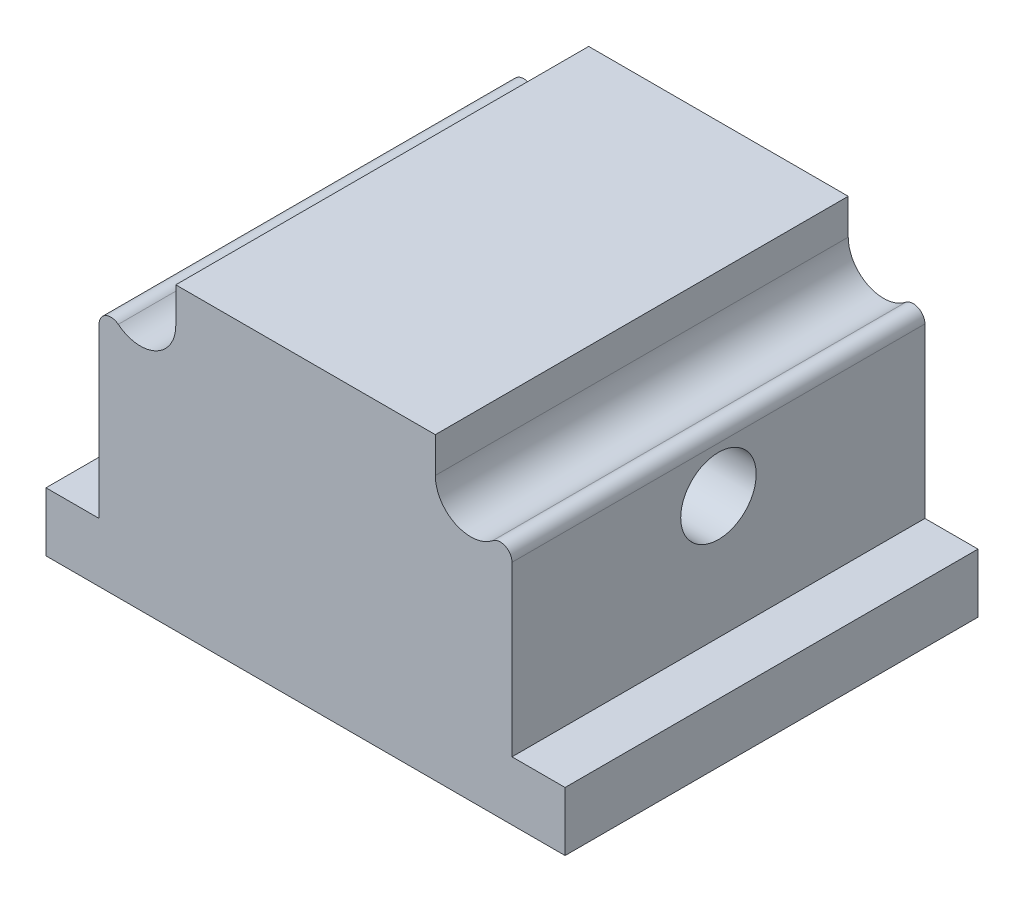
ISO-10303-21;
HEADER;
FILE_DESCRIPTION(('STEP AP214'),'2;1');
FILE_NAME('part.step','',(''),(''),'','','');
FILE_SCHEMA(('AUTOMOTIVE_DESIGN { 1 0 10303 214 1 1 1 1 }'));
ENDSEC;
DATA;
#1=APPLICATION_CONTEXT('core data for automotive mechanical design processes');
#2=APPLICATION_PROTOCOL_DEFINITION('international standard','automotive_design',2000,#1);
#3=PRODUCT_CONTEXT('',#1,'mechanical');
#4=PRODUCT('Part','Part','',(#3));
#5=PRODUCT_RELATED_PRODUCT_CATEGORY('part','',(#4));
#6=PRODUCT_DEFINITION_FORMATION('','',#4);
#7=PRODUCT_DEFINITION_CONTEXT('part definition',#1,'design');
#8=PRODUCT_DEFINITION('design','',#6,#7);
#9=PRODUCT_DEFINITION_SHAPE('','',#8);
#10=(LENGTH_UNIT() NAMED_UNIT(*) SI_UNIT(.MILLI.,.METRE.));
#11=(NAMED_UNIT(*) PLANE_ANGLE_UNIT() SI_UNIT($,.RADIAN.));
#12=(NAMED_UNIT(*) SI_UNIT($,.STERADIAN.) SOLID_ANGLE_UNIT());
#13=UNCERTAINTY_MEASURE_WITH_UNIT(LENGTH_MEASURE(1.E-05),#10,'distance_accuracy_value','');
#14=(GEOMETRIC_REPRESENTATION_CONTEXT(3) GLOBAL_UNCERTAINTY_ASSIGNED_CONTEXT((#13)) GLOBAL_UNIT_ASSIGNED_CONTEXT((#10,
#11,#12)) REPRESENTATION_CONTEXT('',''));
#15=CARTESIAN_POINT('',(0.,0.,0.));
#16=DIRECTION('',(0.,0.,1.));
#17=DIRECTION('',(1.,0.,0.));
#18=AXIS2_PLACEMENT_3D('',#15,#16,#17);
#19=CARTESIAN_POINT('',(0.,-7.7,0.));
#20=DIRECTION('',(0.,-1.,0.));
#21=DIRECTION('',(0.,0.,1.));
#22=AXIS2_PLACEMENT_3D('',#19,#20,#21);
#23=PLANE('',#22);
#24=DIRECTION('',(0.,0.,-1.));
#25=VECTOR('',#24,1.);
#26=CARTESIAN_POINT('',(11.,-7.7,-8.75));
#27=LINE('',#26,#25);
#28=CARTESIAN_POINT('',(11.,-7.7,8.75));
#29=VERTEX_POINT('',#28);
#30=CARTESIAN_POINT('',(11.,-7.7,-8.75));
#31=VERTEX_POINT('',#30);
#32=EDGE_CURVE('E284',#29,#31,#27,.T.);
#33=ORIENTED_EDGE('',*,*,#32,.F.);
#34=DIRECTION('',(1.,0.,0.));
#35=VECTOR('',#34,1.);
#36=CARTESIAN_POINT('',(-11.,-7.7,8.75));
#37=LINE('',#36,#35);
#38=CARTESIAN_POINT('',(-11.,-7.7,8.75));
#39=VERTEX_POINT('',#38);
#40=EDGE_CURVE('E294',#39,#29,#37,.T.);
#41=ORIENTED_EDGE('',*,*,#40,.F.);
#42=DIRECTION('',(0.,0.,1.));
#43=VECTOR('',#42,1.);
#44=CARTESIAN_POINT('',(-11.,-7.7,-8.75));
#45=LINE('',#44,#43);
#46=CARTESIAN_POINT('',(-11.,-7.7,-8.75));
#47=VERTEX_POINT('',#46);
#48=EDGE_CURVE('E291',#47,#39,#45,.T.);
#49=ORIENTED_EDGE('',*,*,#48,.F.);
#50=DIRECTION('',(-1.,0.,0.));
#51=VECTOR('',#50,1.);
#52=CARTESIAN_POINT('',(-11.,-7.7,-8.75));
#53=LINE('',#52,#51);
#54=EDGE_CURVE('E287',#31,#47,#53,.T.);
#55=ORIENTED_EDGE('',*,*,#54,.F.);
#56=EDGE_LOOP('',(#33,#41,#49,#55));
#57=FACE_BOUND('',#56,.T.);
#58=DIRECTION('',(0.951056516295154,0.,0.309016994374947));
#59=VECTOR('',#58,1.);
#60=CARTESIAN_POINT('',(-0.763932022500211,-7.7,2.35114100916989));
#61=LINE('',#60,#59);
#62=CARTESIAN_POINT('',(-8.,-7.7,0.));
#63=VERTEX_POINT('',#62);
#64=CARTESIAN_POINT('',(-2.47213595499958,-7.7,1.79611190631834));
#65=VERTEX_POINT('',#64);
#66=EDGE_CURVE('E214',#63,#65,#61,.T.);
#67=ORIENTED_EDGE('',*,*,#66,.T.);
#68=DIRECTION('',(0.,0.,1.));
#69=VECTOR('',#68,1.);
#70=CARTESIAN_POINT('',(-2.47213595499958,-7.7,0.));
#71=LINE('',#70,#69);
#72=CARTESIAN_POINT('',(-2.47213595499958,-7.7,7.60845213036123));
#73=VERTEX_POINT('',#72);
#74=EDGE_CURVE('E247',#65,#73,#71,.T.);
#75=ORIENTED_EDGE('',*,*,#74,.T.);
#76=DIRECTION('',(-0.587785252292473,0.,0.809016994374948));
#77=VECTOR('',#76,1.);
#78=CARTESIAN_POINT('',(2.,-7.7,1.45308505601072));
#79=LINE('',#78,#77);
#80=CARTESIAN_POINT('',(0.944271909999159,-7.7,2.90617011202144));
#81=VERTEX_POINT('',#80);
#82=EDGE_CURVE('E250',#81,#73,#79,.T.);
#83=ORIENTED_EDGE('',*,*,#82,.F.);
#84=DIRECTION('',(0.951056516295154,0.,0.309016994374947));
#85=VECTOR('',#84,1.);
#86=CARTESIAN_POINT('',(-0.763932022500211,-7.7,2.35114100916989));
#87=LINE('',#86,#85);
#88=CARTESIAN_POINT('',(6.47213595499958,-7.7,4.70228201833979));
#89=VERTEX_POINT('',#88);
#90=EDGE_CURVE('E253',#81,#89,#87,.T.);
#91=ORIENTED_EDGE('',*,*,#90,.T.);
#92=DIRECTION('',(0.587785252292473,0.,0.809016994374947));
#93=VECTOR('',#92,1.);
#94=CARTESIAN_POINT('',(2.,-7.7,-1.45308505601072));
#95=LINE('',#94,#93);
#96=CARTESIAN_POINT('',(3.05572809000084,-7.7,0.));
#97=VERTEX_POINT('',#96);
#98=EDGE_CURVE('E256',#97,#89,#95,.T.);
#99=ORIENTED_EDGE('',*,*,#98,.F.);
#100=DIRECTION('',(-0.587785252292473,0.,0.809016994374948));
#101=VECTOR('',#100,1.);
#102=CARTESIAN_POINT('',(2.,-7.7,1.45308505601072));
#103=LINE('',#102,#101);
#104=CARTESIAN_POINT('',(6.47213595499958,-7.7,-4.70228201833979));
#105=VERTEX_POINT('',#104);
#106=EDGE_CURVE('E259',#105,#97,#103,.T.);
#107=ORIENTED_EDGE('',*,*,#106,.F.);
#108=DIRECTION('',(0.951056516295154,0.,-0.309016994374948));
#109=VECTOR('',#108,1.);
#110=CARTESIAN_POINT('',(-0.763932022500211,-7.7,-2.35114100916989));
#111=LINE('',#110,#109);
#112=CARTESIAN_POINT('',(0.94427190999916,-7.7,-2.90617011202144));
#113=VERTEX_POINT('',#112);
#114=EDGE_CURVE('E262',#113,#105,#111,.T.);
#115=ORIENTED_EDGE('',*,*,#114,.F.);
#116=DIRECTION('',(0.587785252292473,0.,0.809016994374947));
#117=VECTOR('',#116,1.);
#118=CARTESIAN_POINT('',(2.,-7.7,-1.45308505601072));
#119=LINE('',#118,#117);
#120=CARTESIAN_POINT('',(-2.47213595499958,-7.7,-7.60845213036123));
#121=VERTEX_POINT('',#120);
#122=EDGE_CURVE('E223',#121,#113,#119,.T.);
#123=ORIENTED_EDGE('',*,*,#122,.F.);
#124=DIRECTION('',(0.,0.,1.));
#125=VECTOR('',#124,1.);
#126=CARTESIAN_POINT('',(-2.47213595499958,-7.7,0.));
#127=LINE('',#126,#125);
#128=CARTESIAN_POINT('',(-2.47213595499958,-7.7,-1.79611190631834));
#129=VERTEX_POINT('',#128);
#130=EDGE_CURVE('E220',#121,#129,#127,.T.);
#131=ORIENTED_EDGE('',*,*,#130,.T.);
#132=DIRECTION('',(0.951056516295154,0.,-0.309016994374948));
#133=VECTOR('',#132,1.);
#134=CARTESIAN_POINT('',(-0.763932022500211,-7.7,-2.35114100916989));
#135=LINE('',#134,#133);
#136=EDGE_CURVE('E244',#63,#129,#135,.T.);
#137=ORIENTED_EDGE('',*,*,#136,.F.);
#138=EDGE_LOOP('',(#67,#75,#83,#91,#99,#107,#115,#123,#131,#137));
#139=FACE_BOUND('',#138,.T.);
#140=ADVANCED_FACE('F37',(#57,#139),#23,.T.);
#141=CARTESIAN_POINT('',(-8.75,5.,-8.75000000000001));
#142=DIRECTION('',(1.,0.,0.));
#143=DIRECTION('',(0.,0.,1.));
#144=AXIS2_PLACEMENT_3D('',#141,#142,#143);
#145=PLANE('',#144);
#146=CARTESIAN_POINT('',(-8.75000000000001,0.,0.));
#147=DIRECTION('',(-1.,0.,0.));
#148=DIRECTION('',(0.,0.,1.));
#149=AXIS2_PLACEMENT_3D('',#146,#147,#148);
#150=CIRCLE('',#149,1.6);
#151=CARTESIAN_POINT('',(-8.75000000000001,0.,1.6));
#152=VERTEX_POINT('',#151);
#153=EDGE_CURVE('E374',#152,#152,#150,.T.);
#154=ORIENTED_EDGE('',*,*,#153,.F.);
#155=EDGE_LOOP('',(#154));
#156=FACE_BOUND('',#155,.T.);
#157=DIRECTION('',(0.,0.,1.));
#158=VECTOR('',#157,1.);
#159=CARTESIAN_POINT('',(-8.75,1.9387505004004,-8.75000000000001));
#160=LINE('',#159,#158);
#161=CARTESIAN_POINT('',(-8.75,1.9387505004004,-8.75000000000001));
#162=VERTEX_POINT('',#161);
#163=CARTESIAN_POINT('',(-8.75000000000001,1.9387505004004,8.75));
#164=VERTEX_POINT('',#163);
#165=EDGE_CURVE('E340',#162,#164,#160,.T.);
#166=ORIENTED_EDGE('',*,*,#165,.F.);
#167=DIRECTION('',(0.,-1.,0.));
#168=VECTOR('',#167,1.);
#169=CARTESIAN_POINT('',(-8.75,5.,-8.75000000000001));
#170=LINE('',#169,#168);
#171=CARTESIAN_POINT('',(-8.75,-5.2,-8.75000000000001));
#172=VERTEX_POINT('',#171);
#173=EDGE_CURVE('E388',#162,#172,#170,.T.);
#174=ORIENTED_EDGE('',*,*,#173,.T.);
#175=DIRECTION('',(0.,0.,1.));
#176=VECTOR('',#175,1.);
#177=CARTESIAN_POINT('',(-8.75,-5.2,-8.75000000000001));
#178=LINE('',#177,#176);
#179=CARTESIAN_POINT('',(-8.75,-5.2,8.75));
#180=VERTEX_POINT('',#179);
#181=EDGE_CURVE('E320',#172,#180,#178,.T.);
#182=ORIENTED_EDGE('',*,*,#181,.T.);
#183=DIRECTION('',(0.,-1.,0.));
#184=VECTOR('',#183,1.);
#185=CARTESIAN_POINT('',(-8.75000000000001,5.,8.75));
#186=LINE('',#185,#184);
#187=EDGE_CURVE('E45',#164,#180,#186,.T.);
#188=ORIENTED_EDGE('',*,*,#187,.F.);
#189=EDGE_LOOP('',(#166,#174,#182,#188));
#190=FACE_BOUND('',#189,.T.);
#191=ADVANCED_FACE('F399',(#156,#190),#145,.F.);
#192=CARTESIAN_POINT('',(8.75000000000001,5.,-8.75));
#193=DIRECTION('',(-1.,0.,0.));
#194=DIRECTION('',(0.,0.,-1.));
#195=AXIS2_PLACEMENT_3D('',#192,#193,#194);
#196=PLANE('',#195);
#197=CARTESIAN_POINT('',(8.75,0.,0.));
#198=DIRECTION('',(-1.,0.,0.));
#199=DIRECTION('',(0.,0.,1.));
#200=AXIS2_PLACEMENT_3D('',#197,#198,#199);
#201=CIRCLE('',#200,1.6);
#202=CARTESIAN_POINT('',(8.75,0.,1.6));
#203=VERTEX_POINT('',#202);
#204=EDGE_CURVE('E343',#203,#203,#201,.T.);
#205=ORIENTED_EDGE('',*,*,#204,.T.);
#206=EDGE_LOOP('',(#205));
#207=FACE_BOUND('',#206,.T.);
#208=DIRECTION('',(0.,-1.,0.));
#209=VECTOR('',#208,1.);
#210=CARTESIAN_POINT('',(8.75,5.,8.75));
#211=LINE('',#210,#209);
#212=CARTESIAN_POINT('',(8.75,1.9387505004004,8.75000000000001));
#213=VERTEX_POINT('',#212);
#214=CARTESIAN_POINT('',(8.75,-5.2,8.75));
#215=VERTEX_POINT('',#214);
#216=EDGE_CURVE('E11',#213,#215,#211,.T.);
#217=ORIENTED_EDGE('',*,*,#216,.T.);
#218=DIRECTION('',(0.,0.,-1.));
#219=VECTOR('',#218,1.);
#220=CARTESIAN_POINT('',(8.75,-5.2,8.75));
#221=LINE('',#220,#219);
#222=CARTESIAN_POINT('',(8.75000000000001,-5.2,-8.75));
#223=VERTEX_POINT('',#222);
#224=EDGE_CURVE('E317',#215,#223,#221,.T.);
#225=ORIENTED_EDGE('',*,*,#224,.T.);
#226=DIRECTION('',(0.,-1.,0.));
#227=VECTOR('',#226,1.);
#228=CARTESIAN_POINT('',(8.75000000000001,5.,-8.75));
#229=LINE('',#228,#227);
#230=CARTESIAN_POINT('',(8.75000000000001,1.9387505004004,-8.75000000000001));
#231=VERTEX_POINT('',#230);
#232=EDGE_CURVE('E385',#231,#223,#229,.T.);
#233=ORIENTED_EDGE('',*,*,#232,.F.);
#234=DIRECTION('',(0.,0.,1.));
#235=VECTOR('',#234,1.);
#236=CARTESIAN_POINT('',(8.75000000000001,1.9387505004004,-8.75000000000001));
#237=LINE('',#236,#235);
#238=EDGE_CURVE('E336',#231,#213,#237,.T.);
#239=ORIENTED_EDGE('',*,*,#238,.T.);
#240=EDGE_LOOP('',(#217,#225,#233,#239));
#241=FACE_BOUND('',#240,.T.);
#242=ADVANCED_FACE('F39',(#207,#241),#196,.F.);
#243=CARTESIAN_POINT('',(-8.75000000000001,5.,8.75));
#244=DIRECTION('',(0.,0.,-1.));
#245=DIRECTION('',(1.,0.,0.));
#246=AXIS2_PLACEMENT_3D('',#243,#244,#245);
#247=PLANE('',#246);
#248=ORIENTED_EDGE('',*,*,#187,.T.);
#249=DIRECTION('',(1.,0.,0.));
#250=VECTOR('',#249,1.);
#251=CARTESIAN_POINT('',(-11.,-5.2,8.75));
#252=LINE('',#251,#250);
#253=CARTESIAN_POINT('',(-11.,-5.2,8.75));
#254=VERTEX_POINT('',#253);
#255=EDGE_CURVE('E288',#254,#180,#252,.T.);
#256=ORIENTED_EDGE('',*,*,#255,.F.);
#257=DIRECTION('',(0.,1.,0.));
#258=VECTOR('',#257,1.);
#259=CARTESIAN_POINT('',(-11.,-7.7,8.75));
#260=LINE('',#259,#258);
#261=EDGE_CURVE('E308',#39,#254,#260,.T.);
#262=ORIENTED_EDGE('',*,*,#261,.F.);
#263=ORIENTED_EDGE('',*,*,#40,.T.);
#264=DIRECTION('',(0.,1.,0.));
#265=VECTOR('',#264,1.);
#266=CARTESIAN_POINT('',(11.,-7.7,8.75));
#267=LINE('',#266,#265);
#268=CARTESIAN_POINT('',(11.,-5.2,8.75));
#269=VERTEX_POINT('',#268);
#270=EDGE_CURVE('E297',#29,#269,#267,.T.);
#271=ORIENTED_EDGE('',*,*,#270,.T.);
#272=EDGE_CURVE('E304',#215,#269,#252,.T.);
#273=ORIENTED_EDGE('',*,*,#272,.F.);
#274=ORIENTED_EDGE('',*,*,#216,.F.);
#275=CARTESIAN_POINT('',(8.25,1.9387505004004,8.75));
#276=DIRECTION('',(0.,0.,1.));
#277=DIRECTION('',(-1.,0.,0.));
#278=AXIS2_PLACEMENT_3D('',#275,#276,#277);
#279=CIRCLE('',#278,0.500000000000002);
#280=CARTESIAN_POINT('',(7.9375,2.3290628753003,8.75));
#281=VERTEX_POINT('',#280);
#282=EDGE_CURVE('E323',#213,#281,#279,.T.);
#283=ORIENTED_EDGE('',*,*,#282,.T.);
#284=CARTESIAN_POINT('',(7.,3.5,8.75));
#285=DIRECTION('',(0.,0.,-1.));
#286=DIRECTION('',(1.,0.,0.));
#287=AXIS2_PLACEMENT_3D('',#284,#285,#286);
#288=CIRCLE('',#287,1.5);
#289=CARTESIAN_POINT('',(5.5,3.5,8.75));
#290=VERTEX_POINT('',#289);
#291=EDGE_CURVE('E362',#281,#290,#288,.T.);
#292=ORIENTED_EDGE('',*,*,#291,.T.);
#293=DIRECTION('',(0.,1.,0.));
#294=VECTOR('',#293,1.);
#295=CARTESIAN_POINT('',(5.5,3.5,8.75));
#296=LINE('',#295,#294);
#297=CARTESIAN_POINT('',(5.5,5.,8.75));
#298=VERTEX_POINT('',#297);
#299=EDGE_CURVE('E353',#290,#298,#296,.T.);
#300=ORIENTED_EDGE('',*,*,#299,.T.);
#301=DIRECTION('',(-1.,0.,0.));
#302=VECTOR('',#301,1.);
#303=CARTESIAN_POINT('',(-8.75000000000001,5.,8.75));
#304=LINE('',#303,#302);
#305=CARTESIAN_POINT('',(-5.5,5.,8.75));
#306=VERTEX_POINT('',#305);
#307=EDGE_CURVE('E377',#298,#306,#304,.T.);
#308=ORIENTED_EDGE('',*,*,#307,.T.);
#309=DIRECTION('',(0.,-1.,0.));
#310=VECTOR('',#309,1.);
#311=CARTESIAN_POINT('',(-5.5,3.5,8.75));
#312=LINE('',#311,#310);
#313=CARTESIAN_POINT('',(-5.5,3.5,8.75));
#314=VERTEX_POINT('',#313);
#315=EDGE_CURVE('E332',#306,#314,#312,.T.);
#316=ORIENTED_EDGE('',*,*,#315,.T.);
#317=CARTESIAN_POINT('',(-7.,3.5,8.75));
#318=DIRECTION('',(0.,0.,-1.));
#319=DIRECTION('',(-1.,0.,0.));
#320=AXIS2_PLACEMENT_3D('',#317,#318,#319);
#321=CIRCLE('',#320,1.5);
#322=CARTESIAN_POINT('',(-7.9375,2.3290628753003,8.75));
#323=VERTEX_POINT('',#322);
#324=EDGE_CURVE('E335',#314,#323,#321,.T.);
#325=ORIENTED_EDGE('',*,*,#324,.T.);
#326=CARTESIAN_POINT('',(-8.25,1.9387505004004,8.75));
#327=DIRECTION('',(0.,0.,1.));
#328=DIRECTION('',(1.,0.,0.));
#329=AXIS2_PLACEMENT_3D('',#326,#327,#328);
#330=CIRCLE('',#329,0.500000000000002);
#331=EDGE_CURVE('E327',#323,#164,#330,.T.);
#332=ORIENTED_EDGE('',*,*,#331,.T.);
#333=EDGE_LOOP('',(#248,#256,#262,#263,#271,#273,#274,#283,#292,#300,#308,#316,#325,#332));
#334=FACE_BOUND('',#333,.T.);
#335=ADVANCED_FACE('F394',(#334),#247,.F.);
#336=CARTESIAN_POINT('',(-8.75,5.,-8.75000000000001));
#337=DIRECTION('',(0.,0.,1.));
#338=DIRECTION('',(-1.,0.,0.));
#339=AXIS2_PLACEMENT_3D('',#336,#337,#338);
#340=PLANE('',#339);
#341=CARTESIAN_POINT('',(-7.,3.5,-8.75000000000001));
#342=DIRECTION('',(0.,0.,-1.));
#343=DIRECTION('',(-1.,0.,0.));
#344=AXIS2_PLACEMENT_3D('',#341,#342,#343);
#345=CIRCLE('',#344,1.5);
#346=CARTESIAN_POINT('',(-5.5,3.5,-8.75000000000001));
#347=VERTEX_POINT('',#346);
#348=CARTESIAN_POINT('',(-7.9375,2.3290628753003,-8.75000000000001));
#349=VERTEX_POINT('',#348);
#350=EDGE_CURVE('E326',#347,#349,#345,.T.);
#351=ORIENTED_EDGE('',*,*,#350,.F.);
#352=DIRECTION('',(0.,-1.,0.));
#353=VECTOR('',#352,1.);
#354=CARTESIAN_POINT('',(-5.5,3.5,-8.75000000000001));
#355=LINE('',#354,#353);
#356=CARTESIAN_POINT('',(-5.5,5.,-8.75000000000001));
#357=VERTEX_POINT('',#356);
#358=EDGE_CURVE('E324',#357,#347,#355,.T.);
#359=ORIENTED_EDGE('',*,*,#358,.F.);
#360=DIRECTION('',(1.,0.,0.));
#361=VECTOR('',#360,1.);
#362=CARTESIAN_POINT('',(-8.75,5.,-8.75000000000001));
#363=LINE('',#362,#361);
#364=CARTESIAN_POINT('',(5.5,5.,-8.75000000000001));
#365=VERTEX_POINT('',#364);
#366=EDGE_CURVE('E382',#357,#365,#363,.T.);
#367=ORIENTED_EDGE('',*,*,#366,.T.);
#368=DIRECTION('',(0.,1.,0.));
#369=VECTOR('',#368,1.);
#370=CARTESIAN_POINT('',(5.5,3.5,-8.75000000000001));
#371=LINE('',#370,#369);
#372=CARTESIAN_POINT('',(5.5,3.5,-8.75000000000001));
#373=VERTEX_POINT('',#372);
#374=EDGE_CURVE('E356',#373,#365,#371,.T.);
#375=ORIENTED_EDGE('',*,*,#374,.F.);
#376=CARTESIAN_POINT('',(7.,3.5,-8.75000000000001));
#377=DIRECTION('',(0.,0.,-1.));
#378=DIRECTION('',(1.,0.,0.));
#379=AXIS2_PLACEMENT_3D('',#376,#377,#378);
#380=CIRCLE('',#379,1.5);
#381=CARTESIAN_POINT('',(7.9375,2.3290628753003,-8.75000000000001));
#382=VERTEX_POINT('',#381);
#383=EDGE_CURVE('E352',#382,#373,#380,.T.);
#384=ORIENTED_EDGE('',*,*,#383,.F.);
#385=CARTESIAN_POINT('',(8.25,1.9387505004004,-8.75000000000001));
#386=DIRECTION('',(0.,0.,1.));
#387=DIRECTION('',(-1.,0.,0.));
#388=AXIS2_PLACEMENT_3D('',#385,#386,#387);
#389=CIRCLE('',#388,0.500000000000002);
#390=EDGE_CURVE('E349',#231,#382,#389,.T.);
#391=ORIENTED_EDGE('',*,*,#390,.F.);
#392=ORIENTED_EDGE('',*,*,#232,.T.);
#393=DIRECTION('',(-1.,0.,0.));
#394=VECTOR('',#393,1.);
#395=CARTESIAN_POINT('',(-11.,-5.2,-8.75));
#396=LINE('',#395,#394);
#397=CARTESIAN_POINT('',(11.,-5.2,-8.75));
#398=VERTEX_POINT('',#397);
#399=EDGE_CURVE('E300',#398,#223,#396,.T.);
#400=ORIENTED_EDGE('',*,*,#399,.F.);
#401=DIRECTION('',(0.,1.,0.));
#402=VECTOR('',#401,1.);
#403=CARTESIAN_POINT('',(11.,-7.7,-8.75));
#404=LINE('',#403,#402);
#405=EDGE_CURVE('E314',#31,#398,#404,.T.);
#406=ORIENTED_EDGE('',*,*,#405,.F.);
#407=ORIENTED_EDGE('',*,*,#54,.T.);
#408=DIRECTION('',(0.,1.,0.));
#409=VECTOR('',#408,1.);
#410=CARTESIAN_POINT('',(-11.,-7.7,-8.75));
#411=LINE('',#410,#409);
#412=CARTESIAN_POINT('',(-11.,-5.2,-8.75));
#413=VERTEX_POINT('',#412);
#414=EDGE_CURVE('E311',#47,#413,#411,.T.);
#415=ORIENTED_EDGE('',*,*,#414,.T.);
#416=EDGE_CURVE('E299',#172,#413,#396,.T.);
#417=ORIENTED_EDGE('',*,*,#416,.F.);
#418=ORIENTED_EDGE('',*,*,#173,.F.);
#419=CARTESIAN_POINT('',(-8.25,1.9387505004004,-8.75000000000001));
#420=DIRECTION('',(0.,0.,1.));
#421=DIRECTION('',(1.,0.,0.));
#422=AXIS2_PLACEMENT_3D('',#419,#420,#421);
#423=CIRCLE('',#422,0.500000000000002);
#424=EDGE_CURVE('E330',#349,#162,#423,.T.);
#425=ORIENTED_EDGE('',*,*,#424,.F.);
#426=EDGE_LOOP('',(#351,#359,#367,#375,#384,#391,#392,#400,#406,#407,#415,#417,#418,#425));
#427=FACE_BOUND('',#426,.T.);
#428=ADVANCED_FACE('F446',(#427),#340,.F.);
#429=CARTESIAN_POINT('',(0.,5.,0.));
#430=DIRECTION('',(0.,-1.,0.));
#431=DIRECTION('',(0.,0.,1.));
#432=AXIS2_PLACEMENT_3D('',#429,#430,#431);
#433=PLANE('',#432);
#434=ORIENTED_EDGE('',*,*,#307,.F.);
#435=DIRECTION('',(0.,0.,1.));
#436=VECTOR('',#435,1.);
#437=CARTESIAN_POINT('',(5.5,5.,-8.75000000000001));
#438=LINE('',#437,#436);
#439=EDGE_CURVE('E369',#365,#298,#438,.T.);
#440=ORIENTED_EDGE('',*,*,#439,.F.);
#441=ORIENTED_EDGE('',*,*,#366,.F.);
#442=DIRECTION('',(0.,0.,1.));
#443=VECTOR('',#442,1.);
#444=CARTESIAN_POINT('',(-5.5,5.,-8.75000000000001));
#445=LINE('',#444,#443);
#446=EDGE_CURVE('E60',#357,#306,#445,.T.);
#447=ORIENTED_EDGE('',*,*,#446,.T.);
#448=EDGE_LOOP('',(#434,#440,#441,#447));
#449=FACE_BOUND('',#448,.T.);
#450=ADVANCED_FACE('F435',(#449),#433,.F.);
#451=CARTESIAN_POINT('',(-8.75000000000001,0.,0.));
#452=DIRECTION('',(1.,0.,0.));
#453=DIRECTION('',(0.,0.,1.));
#454=AXIS2_PLACEMENT_3D('',#451,#452,#453);
#455=CYLINDRICAL_SURFACE('',#454,1.6);
#456=ORIENTED_EDGE('',*,*,#153,.T.);
#457=EDGE_LOOP('',(#456));
#458=FACE_BOUND('',#457,.T.);
#459=ORIENTED_EDGE('',*,*,#204,.F.);
#460=EDGE_LOOP('',(#459));
#461=FACE_BOUND('',#460,.T.);
#462=ADVANCED_FACE('F453',(#458,#461),#455,.F.);
#463=CARTESIAN_POINT('',(8.25,1.9387505004004,-8.75000000000001));
#464=DIRECTION('',(0.,0.,1.));
#465=DIRECTION('',(-1.,0.,0.));
#466=AXIS2_PLACEMENT_3D('',#463,#464,#465);
#467=CYLINDRICAL_SURFACE('',#466,0.500000000000002);
#468=ORIENTED_EDGE('',*,*,#282,.F.);
#469=ORIENTED_EDGE('',*,*,#238,.F.);
#470=ORIENTED_EDGE('',*,*,#390,.T.);
#471=DIRECTION('',(0.,0.,1.));
#472=VECTOR('',#471,1.);
#473=CARTESIAN_POINT('',(7.9375,2.3290628753003,-8.75000000000001));
#474=LINE('',#473,#472);
#475=EDGE_CURVE('E359',#382,#281,#474,.T.);
#476=ORIENTED_EDGE('',*,*,#475,.T.);
#477=EDGE_LOOP('',(#468,#469,#470,#476));
#478=FACE_BOUND('',#477,.T.);
#479=ADVANCED_FACE('F424',(#478),#467,.T.);
#480=CARTESIAN_POINT('',(5.5,3.5,-8.75000000000001));
#481=DIRECTION('',(-1.,0.,0.));
#482=DIRECTION('',(0.,0.,-1.));
#483=AXIS2_PLACEMENT_3D('',#480,#481,#482);
#484=PLANE('',#483);
#485=ORIENTED_EDGE('',*,*,#299,.F.);
#486=DIRECTION('',(0.,0.,1.));
#487=VECTOR('',#486,1.);
#488=CARTESIAN_POINT('',(5.5,3.5,-8.75000000000001));
#489=LINE('',#488,#487);
#490=EDGE_CURVE('E371',#373,#290,#489,.T.);
#491=ORIENTED_EDGE('',*,*,#490,.F.);
#492=ORIENTED_EDGE('',*,*,#374,.T.);
#493=ORIENTED_EDGE('',*,*,#439,.T.);
#494=EDGE_LOOP('',(#485,#491,#492,#493));
#495=FACE_BOUND('',#494,.T.);
#496=ADVANCED_FACE('F432',(#495),#484,.F.);
#497=CARTESIAN_POINT('',(7.,3.5,-8.75000000000001));
#498=DIRECTION('',(0.,0.,1.));
#499=DIRECTION('',(-1.,0.,0.));
#500=AXIS2_PLACEMENT_3D('',#497,#498,#499);
#501=CYLINDRICAL_SURFACE('',#500,1.5);
#502=ORIENTED_EDGE('',*,*,#291,.F.);
#503=ORIENTED_EDGE('',*,*,#475,.F.);
#504=ORIENTED_EDGE('',*,*,#383,.T.);
#505=ORIENTED_EDGE('',*,*,#490,.T.);
#506=EDGE_LOOP('',(#502,#503,#504,#505));
#507=FACE_BOUND('',#506,.T.);
#508=ADVANCED_FACE('F428',(#507),#501,.F.);
#509=CARTESIAN_POINT('',(-8.25,1.9387505004004,-8.75000000000001));
#510=DIRECTION('',(0.,0.,1.));
#511=DIRECTION('',(-1.,0.,0.));
#512=AXIS2_PLACEMENT_3D('',#509,#510,#511);
#513=CYLINDRICAL_SURFACE('',#512,0.500000000000002);
#514=ORIENTED_EDGE('',*,*,#331,.F.);
#515=DIRECTION('',(0.,0.,1.));
#516=VECTOR('',#515,1.);
#517=CARTESIAN_POINT('',(-7.9375,2.3290628753003,-8.75000000000001));
#518=LINE('',#517,#516);
#519=EDGE_CURVE('E344',#349,#323,#518,.T.);
#520=ORIENTED_EDGE('',*,*,#519,.F.);
#521=ORIENTED_EDGE('',*,*,#424,.T.);
#522=ORIENTED_EDGE('',*,*,#165,.T.);
#523=EDGE_LOOP('',(#514,#520,#521,#522));
#524=FACE_BOUND('',#523,.T.);
#525=ADVANCED_FACE('F444',(#524),#513,.T.);
#526=CARTESIAN_POINT('',(-7.,3.5,-8.75000000000001));
#527=DIRECTION('',(0.,0.,1.));
#528=DIRECTION('',(-1.,0.,0.));
#529=AXIS2_PLACEMENT_3D('',#526,#527,#528);
#530=CYLINDRICAL_SURFACE('',#529,1.5);
#531=ORIENTED_EDGE('',*,*,#324,.F.);
#532=DIRECTION('',(0.,0.,1.));
#533=VECTOR('',#532,1.);
#534=CARTESIAN_POINT('',(-5.5,3.5,-8.75000000000001));
#535=LINE('',#534,#533);
#536=EDGE_CURVE('E346',#347,#314,#535,.T.);
#537=ORIENTED_EDGE('',*,*,#536,.F.);
#538=ORIENTED_EDGE('',*,*,#350,.T.);
#539=ORIENTED_EDGE('',*,*,#519,.T.);
#540=EDGE_LOOP('',(#531,#537,#538,#539));
#541=FACE_BOUND('',#540,.T.);
#542=ADVANCED_FACE('F440',(#541),#530,.F.);
#543=CARTESIAN_POINT('',(-5.5,3.5,-8.75000000000001));
#544=DIRECTION('',(1.,0.,0.));
#545=DIRECTION('',(0.,1.,0.));
#546=AXIS2_PLACEMENT_3D('',#543,#544,#545);
#547=PLANE('',#546);
#548=ORIENTED_EDGE('',*,*,#315,.F.);
#549=ORIENTED_EDGE('',*,*,#446,.F.);
#550=ORIENTED_EDGE('',*,*,#358,.T.);
#551=ORIENTED_EDGE('',*,*,#536,.T.);
#552=EDGE_LOOP('',(#548,#549,#550,#551));
#553=FACE_BOUND('',#552,.T.);
#554=ADVANCED_FACE('F437',(#553),#547,.F.);
#555=CARTESIAN_POINT('',(0.,-5.2,0.));
#556=DIRECTION('',(0.,-1.,0.));
#557=DIRECTION('',(0.,0.,1.));
#558=AXIS2_PLACEMENT_3D('',#555,#556,#557);
#559=PLANE('',#558);
#560=ORIENTED_EDGE('',*,*,#272,.T.);
#561=DIRECTION('',(0.,0.,-1.));
#562=VECTOR('',#561,1.);
#563=CARTESIAN_POINT('',(11.,-5.2,-8.75));
#564=LINE('',#563,#562);
#565=EDGE_CURVE('E268',#269,#398,#564,.T.);
#566=ORIENTED_EDGE('',*,*,#565,.T.);
#567=ORIENTED_EDGE('',*,*,#399,.T.);
#568=ORIENTED_EDGE('',*,*,#224,.F.);
#569=EDGE_LOOP('',(#560,#566,#567,#568));
#570=FACE_BOUND('',#569,.T.);
#571=ADVANCED_FACE('F418',(#570),#559,.F.);
#572=ORIENTED_EDGE('',*,*,#416,.T.);
#573=DIRECTION('',(0.,0.,1.));
#574=VECTOR('',#573,1.);
#575=CARTESIAN_POINT('',(-11.,-5.2,-8.75));
#576=LINE('',#575,#574);
#577=EDGE_CURVE('E302',#413,#254,#576,.T.);
#578=ORIENTED_EDGE('',*,*,#577,.T.);
#579=ORIENTED_EDGE('',*,*,#255,.T.);
#580=ORIENTED_EDGE('',*,*,#181,.F.);
#581=EDGE_LOOP('',(#572,#578,#579,#580));
#582=FACE_BOUND('',#581,.T.);
#583=ADVANCED_FACE('F403',(#582),#559,.F.);
#584=CARTESIAN_POINT('',(11.,-7.7,-8.75));
#585=DIRECTION('',(-1.,0.,0.));
#586=DIRECTION('',(0.,0.,-1.));
#587=AXIS2_PLACEMENT_3D('',#584,#585,#586);
#588=PLANE('',#587);
#589=ORIENTED_EDGE('',*,*,#565,.F.);
#590=ORIENTED_EDGE('',*,*,#270,.F.);
#591=ORIENTED_EDGE('',*,*,#32,.T.);
#592=ORIENTED_EDGE('',*,*,#405,.T.);
#593=EDGE_LOOP('',(#589,#590,#591,#592));
#594=FACE_BOUND('',#593,.T.);
#595=ADVANCED_FACE('F413',(#594),#588,.F.);
#596=CARTESIAN_POINT('',(-11.,-7.7,-8.75));
#597=DIRECTION('',(1.,0.,0.));
#598=DIRECTION('',(0.,0.,1.));
#599=AXIS2_PLACEMENT_3D('',#596,#597,#598);
#600=PLANE('',#599);
#601=ORIENTED_EDGE('',*,*,#577,.F.);
#602=ORIENTED_EDGE('',*,*,#414,.F.);
#603=ORIENTED_EDGE('',*,*,#48,.T.);
#604=ORIENTED_EDGE('',*,*,#261,.T.);
#605=EDGE_LOOP('',(#601,#602,#603,#604));
#606=FACE_BOUND('',#605,.T.);
#607=ADVANCED_FACE('F405',(#606),#600,.F.);
#608=CARTESIAN_POINT('',(-0.763932022500211,-6.2,-2.35114100916989));
#609=DIRECTION('',(0.309016994374948,0.,0.951056516295153));
#610=DIRECTION('',(-0.951056516295154,0.,0.309016994374948));
#611=AXIS2_PLACEMENT_3D('',#608,#609,#610);
#612=PLANE('',#611);
#613=ORIENTED_EDGE('',*,*,#136,.T.);
#614=DIRECTION('',(0.,-1.,0.));
#615=VECTOR('',#614,1.);
#616=CARTESIAN_POINT('',(-2.47213595499958,-6.2,-1.79611190631834));
#617=LINE('',#616,#615);
#618=CARTESIAN_POINT('',(-2.47213595499958,-6.2,-1.79611190631834));
#619=VERTEX_POINT('',#618);
#620=EDGE_CURVE('E219',#619,#129,#617,.T.);
#621=ORIENTED_EDGE('',*,*,#620,.F.);
#622=DIRECTION('',(0.951056516295154,0.,-0.309016994374948));
#623=VECTOR('',#622,1.);
#624=CARTESIAN_POINT('',(-0.763932022500211,-6.2,-2.35114100916989));
#625=LINE('',#624,#623);
#626=CARTESIAN_POINT('',(-8.,-6.2,0.));
#627=VERTEX_POINT('',#626);
#628=EDGE_CURVE('E204',#627,#619,#625,.T.);
#629=ORIENTED_EDGE('',*,*,#628,.F.);
#630=DIRECTION('',(0.,-1.,0.));
#631=VECTOR('',#630,1.);
#632=CARTESIAN_POINT('',(-8.,-6.2,0.));
#633=LINE('',#632,#631);
#634=EDGE_CURVE('E52',#627,#63,#633,.T.);
#635=ORIENTED_EDGE('',*,*,#634,.T.);
#636=EDGE_LOOP('',(#613,#621,#629,#635));
#637=FACE_BOUND('',#636,.T.);
#638=ADVANCED_FACE('F218',(#637),#612,.T.);
#639=CARTESIAN_POINT('',(-2.47213595499958,-6.2,0.));
#640=DIRECTION('',(-1.,0.,0.));
#641=DIRECTION('',(0.,0.,-1.));
#642=AXIS2_PLACEMENT_3D('',#639,#640,#641);
#643=PLANE('',#642);
#644=ORIENTED_EDGE('',*,*,#130,.F.);
#645=DIRECTION('',(0.,-1.,0.));
#646=VECTOR('',#645,1.);
#647=CARTESIAN_POINT('',(-2.47213595499958,-6.2,-7.60845213036123));
#648=LINE('',#647,#646);
#649=CARTESIAN_POINT('',(-2.47213595499958,-6.2,-7.60845213036123));
#650=VERTEX_POINT('',#649);
#651=EDGE_CURVE('E269',#650,#121,#648,.T.);
#652=ORIENTED_EDGE('',*,*,#651,.F.);
#653=DIRECTION('',(0.,0.,1.));
#654=VECTOR('',#653,1.);
#655=CARTESIAN_POINT('',(-2.47213595499958,-6.2,0.));
#656=LINE('',#655,#654);
#657=EDGE_CURVE('E216',#650,#619,#656,.T.);
#658=ORIENTED_EDGE('',*,*,#657,.T.);
#659=ORIENTED_EDGE('',*,*,#620,.T.);
#660=EDGE_LOOP('',(#644,#652,#658,#659));
#661=FACE_BOUND('',#660,.T.);
#662=ADVANCED_FACE('F587',(#661),#643,.F.);
#663=CARTESIAN_POINT('',(2.,-6.2,-1.45308505601072));
#664=DIRECTION('',(-0.809016994374947,0.,0.587785252292473));
#665=DIRECTION('',(-0.587785252292473,0.,-0.809016994374948));
#666=AXIS2_PLACEMENT_3D('',#663,#664,#665);
#667=PLANE('',#666);
#668=ORIENTED_EDGE('',*,*,#122,.T.);
#669=DIRECTION('',(0.,-1.,0.));
#670=VECTOR('',#669,1.);
#671=CARTESIAN_POINT('',(0.94427190999916,-6.2,-2.90617011202144));
#672=LINE('',#671,#670);
#673=CARTESIAN_POINT('',(0.94427190999916,-6.2,-2.90617011202144));
#674=VERTEX_POINT('',#673);
#675=EDGE_CURVE('E271',#674,#113,#672,.T.);
#676=ORIENTED_EDGE('',*,*,#675,.F.);
#677=DIRECTION('',(0.587785252292473,0.,0.809016994374947));
#678=VECTOR('',#677,1.);
#679=CARTESIAN_POINT('',(2.,-6.2,-1.45308505601072));
#680=LINE('',#679,#678);
#681=EDGE_CURVE('E240',#650,#674,#680,.T.);
#682=ORIENTED_EDGE('',*,*,#681,.F.);
#683=ORIENTED_EDGE('',*,*,#651,.T.);
#684=EDGE_LOOP('',(#668,#676,#682,#683));
#685=FACE_BOUND('',#684,.T.);
#686=ADVANCED_FACE('F595',(#685),#667,.T.);
#687=CARTESIAN_POINT('',(-0.763932022500211,-6.2,-2.35114100916989));
#688=DIRECTION('',(0.309016994374948,0.,0.951056516295153));
#689=DIRECTION('',(-0.951056516295154,0.,0.309016994374948));
#690=AXIS2_PLACEMENT_3D('',#687,#688,#689);
#691=PLANE('',#690);
#692=ORIENTED_EDGE('',*,*,#114,.T.);
#693=DIRECTION('',(0.,-1.,0.));
#694=VECTOR('',#693,1.);
#695=CARTESIAN_POINT('',(6.47213595499958,-6.2,-4.70228201833979));
#696=LINE('',#695,#694);
#697=CARTESIAN_POINT('',(6.47213595499958,-6.2,-4.70228201833979));
#698=VERTEX_POINT('',#697);
#699=EDGE_CURVE('E273',#698,#105,#696,.T.);
#700=ORIENTED_EDGE('',*,*,#699,.F.);
#701=DIRECTION('',(0.951056516295154,0.,-0.309016994374948));
#702=VECTOR('',#701,1.);
#703=CARTESIAN_POINT('',(-0.763932022500211,-6.2,-2.35114100916989));
#704=LINE('',#703,#702);
#705=EDGE_CURVE('E237',#674,#698,#704,.T.);
#706=ORIENTED_EDGE('',*,*,#705,.F.);
#707=ORIENTED_EDGE('',*,*,#675,.T.);
#708=EDGE_LOOP('',(#692,#700,#706,#707));
#709=FACE_BOUND('',#708,.T.);
#710=ADVANCED_FACE('F605',(#709),#691,.T.);
#711=CARTESIAN_POINT('',(2.,-6.2,1.45308505601072));
#712=DIRECTION('',(-0.809016994374947,0.,-0.587785252292473));
#713=DIRECTION('',(0.587785252292473,0.,-0.809016994374947));
#714=AXIS2_PLACEMENT_3D('',#711,#712,#713);
#715=PLANE('',#714);
#716=ORIENTED_EDGE('',*,*,#106,.T.);
#717=DIRECTION('',(0.,-1.,0.));
#718=VECTOR('',#717,1.);
#719=CARTESIAN_POINT('',(3.05572809000084,-6.2,0.));
#720=LINE('',#719,#718);
#721=CARTESIAN_POINT('',(3.05572809000084,-6.2,0.));
#722=VERTEX_POINT('',#721);
#723=EDGE_CURVE('E275',#722,#97,#720,.T.);
#724=ORIENTED_EDGE('',*,*,#723,.F.);
#725=DIRECTION('',(-0.587785252292473,0.,0.809016994374948));
#726=VECTOR('',#725,1.);
#727=CARTESIAN_POINT('',(2.,-6.2,1.45308505601072));
#728=LINE('',#727,#726);
#729=EDGE_CURVE('E234',#698,#722,#728,.T.);
#730=ORIENTED_EDGE('',*,*,#729,.F.);
#731=ORIENTED_EDGE('',*,*,#699,.T.);
#732=EDGE_LOOP('',(#716,#724,#730,#731));
#733=FACE_BOUND('',#732,.T.);
#734=ADVANCED_FACE('F615',(#733),#715,.T.);
#735=CARTESIAN_POINT('',(2.,-6.2,-1.45308505601072));
#736=DIRECTION('',(-0.809016994374947,0.,0.587785252292473));
#737=DIRECTION('',(-0.587785252292473,0.,-0.809016994374948));
#738=AXIS2_PLACEMENT_3D('',#735,#736,#737);
#739=PLANE('',#738);
#740=ORIENTED_EDGE('',*,*,#98,.T.);
#741=DIRECTION('',(0.,-1.,0.));
#742=VECTOR('',#741,1.);
#743=CARTESIAN_POINT('',(6.47213595499958,-6.2,4.70228201833979));
#744=LINE('',#743,#742);
#745=CARTESIAN_POINT('',(6.47213595499958,-6.2,4.70228201833979));
#746=VERTEX_POINT('',#745);
#747=EDGE_CURVE('E277',#746,#89,#744,.T.);
#748=ORIENTED_EDGE('',*,*,#747,.F.);
#749=DIRECTION('',(0.587785252292473,0.,0.809016994374947));
#750=VECTOR('',#749,1.);
#751=CARTESIAN_POINT('',(2.,-6.2,-1.45308505601072));
#752=LINE('',#751,#750);
#753=EDGE_CURVE('E231',#722,#746,#752,.T.);
#754=ORIENTED_EDGE('',*,*,#753,.F.);
#755=ORIENTED_EDGE('',*,*,#723,.T.);
#756=EDGE_LOOP('',(#740,#748,#754,#755));
#757=FACE_BOUND('',#756,.T.);
#758=ADVANCED_FACE('F625',(#757),#739,.T.);
#759=CARTESIAN_POINT('',(-0.763932022500211,-6.2,2.35114100916989));
#760=DIRECTION('',(-0.309016994374947,0.,0.951056516295154));
#761=DIRECTION('',(-0.951056516295154,0.,-0.309016994374947));
#762=AXIS2_PLACEMENT_3D('',#759,#760,#761);
#763=PLANE('',#762);
#764=ORIENTED_EDGE('',*,*,#90,.F.);
#765=DIRECTION('',(0.,-1.,0.));
#766=VECTOR('',#765,1.);
#767=CARTESIAN_POINT('',(0.944271909999159,-6.2,2.90617011202144));
#768=LINE('',#767,#766);
#769=CARTESIAN_POINT('',(0.944271909999159,-6.2,2.90617011202144));
#770=VERTEX_POINT('',#769);
#771=EDGE_CURVE('E279',#770,#81,#768,.T.);
#772=ORIENTED_EDGE('',*,*,#771,.F.);
#773=DIRECTION('',(0.951056516295154,0.,0.309016994374947));
#774=VECTOR('',#773,1.);
#775=CARTESIAN_POINT('',(-0.763932022500211,-6.2,2.35114100916989));
#776=LINE('',#775,#774);
#777=EDGE_CURVE('E229',#770,#746,#776,.T.);
#778=ORIENTED_EDGE('',*,*,#777,.T.);
#779=ORIENTED_EDGE('',*,*,#747,.T.);
#780=EDGE_LOOP('',(#764,#772,#778,#779));
#781=FACE_BOUND('',#780,.T.);
#782=ADVANCED_FACE('F635',(#781),#763,.F.);
#783=CARTESIAN_POINT('',(2.,-6.2,1.45308505601072));
#784=DIRECTION('',(-0.809016994374947,0.,-0.587785252292473));
#785=DIRECTION('',(0.587785252292473,0.,-0.809016994374947));
#786=AXIS2_PLACEMENT_3D('',#783,#784,#785);
#787=PLANE('',#786);
#788=ORIENTED_EDGE('',*,*,#82,.T.);
#789=DIRECTION('',(0.,-1.,0.));
#790=VECTOR('',#789,1.);
#791=CARTESIAN_POINT('',(-2.47213595499958,-6.2,7.60845213036123));
#792=LINE('',#791,#790);
#793=CARTESIAN_POINT('',(-2.47213595499958,-6.2,7.60845213036123));
#794=VERTEX_POINT('',#793);
#795=EDGE_CURVE('E281',#794,#73,#792,.T.);
#796=ORIENTED_EDGE('',*,*,#795,.F.);
#797=DIRECTION('',(-0.587785252292473,0.,0.809016994374948));
#798=VECTOR('',#797,1.);
#799=CARTESIAN_POINT('',(2.,-6.2,1.45308505601072));
#800=LINE('',#799,#798);
#801=EDGE_CURVE('E227',#770,#794,#800,.T.);
#802=ORIENTED_EDGE('',*,*,#801,.F.);
#803=ORIENTED_EDGE('',*,*,#771,.T.);
#804=EDGE_LOOP('',(#788,#796,#802,#803));
#805=FACE_BOUND('',#804,.T.);
#806=ADVANCED_FACE('F645',(#805),#787,.T.);
#807=CARTESIAN_POINT('',(-2.47213595499958,-6.2,0.));
#808=DIRECTION('',(-1.,0.,0.));
#809=DIRECTION('',(0.,0.,-1.));
#810=AXIS2_PLACEMENT_3D('',#807,#808,#809);
#811=PLANE('',#810);
#812=ORIENTED_EDGE('',*,*,#74,.F.);
#813=DIRECTION('',(0.,-1.,0.));
#814=VECTOR('',#813,1.);
#815=CARTESIAN_POINT('',(-2.47213595499958,-6.2,1.79611190631834));
#816=LINE('',#815,#814);
#817=CARTESIAN_POINT('',(-2.47213595499958,-6.2,1.79611190631834));
#818=VERTEX_POINT('',#817);
#819=EDGE_CURVE('E215',#818,#65,#816,.T.);
#820=ORIENTED_EDGE('',*,*,#819,.F.);
#821=DIRECTION('',(0.,0.,1.));
#822=VECTOR('',#821,1.);
#823=CARTESIAN_POINT('',(-2.47213595499958,-6.2,0.));
#824=LINE('',#823,#822);
#825=EDGE_CURVE('E207',#818,#794,#824,.T.);
#826=ORIENTED_EDGE('',*,*,#825,.T.);
#827=ORIENTED_EDGE('',*,*,#795,.T.);
#828=EDGE_LOOP('',(#812,#820,#826,#827));
#829=FACE_BOUND('',#828,.T.);
#830=ADVANCED_FACE('F655',(#829),#811,.F.);
#831=CARTESIAN_POINT('',(-0.763932022500211,-6.2,2.35114100916989));
#832=DIRECTION('',(-0.309016994374947,0.,0.951056516295154));
#833=DIRECTION('',(-0.951056516295154,0.,-0.309016994374947));
#834=AXIS2_PLACEMENT_3D('',#831,#832,#833);
#835=PLANE('',#834);
#836=ORIENTED_EDGE('',*,*,#66,.F.);
#837=ORIENTED_EDGE('',*,*,#634,.F.);
#838=DIRECTION('',(0.951056516295154,0.,0.309016994374947));
#839=VECTOR('',#838,1.);
#840=CARTESIAN_POINT('',(-0.763932022500211,-6.2,2.35114100916989));
#841=LINE('',#840,#839);
#842=EDGE_CURVE('E201',#627,#818,#841,.T.);
#843=ORIENTED_EDGE('',*,*,#842,.T.);
#844=ORIENTED_EDGE('',*,*,#819,.T.);
#845=EDGE_LOOP('',(#836,#837,#843,#844));
#846=FACE_BOUND('',#845,.T.);
#847=ADVANCED_FACE('F212',(#846),#835,.F.);
#848=CARTESIAN_POINT('',(0.,-6.2,0.));
#849=DIRECTION('',(0.,-1.,0.));
#850=DIRECTION('',(0.,0.,1.));
#851=AXIS2_PLACEMENT_3D('',#848,#849,#850);
#852=PLANE('',#851);
#853=ORIENTED_EDGE('',*,*,#628,.T.);
#854=ORIENTED_EDGE('',*,*,#657,.F.);
#855=ORIENTED_EDGE('',*,*,#681,.T.);
#856=ORIENTED_EDGE('',*,*,#705,.T.);
#857=ORIENTED_EDGE('',*,*,#729,.T.);
#858=ORIENTED_EDGE('',*,*,#753,.T.);
#859=ORIENTED_EDGE('',*,*,#777,.F.);
#860=ORIENTED_EDGE('',*,*,#801,.T.);
#861=ORIENTED_EDGE('',*,*,#825,.F.);
#862=ORIENTED_EDGE('',*,*,#842,.F.);
#863=EDGE_LOOP('',(#853,#854,#855,#856,#857,#858,#859,#860,#861,#862));
#864=FACE_BOUND('',#863,.T.);
#865=ADVANCED_FACE('F202',(#864),#852,.T.);
#866=CLOSED_SHELL('',(#140,#191,#242,#335,#428,#450,#462,#479,#496,#508,#525,#542,#554,#571,
#583,#595,#607,#638,#662,#686,#710,#734,#758,#782,#806,#830,#847,#865));
#867=MANIFOLD_SOLID_BREP('B2',#866);
#868=ADVANCED_BREP_SHAPE_REPRESENTATION('',(#18,#867),#14);
#869=SHAPE_DEFINITION_REPRESENTATION(#9,#868);
ENDSEC;
END-ISO-10303-21;
